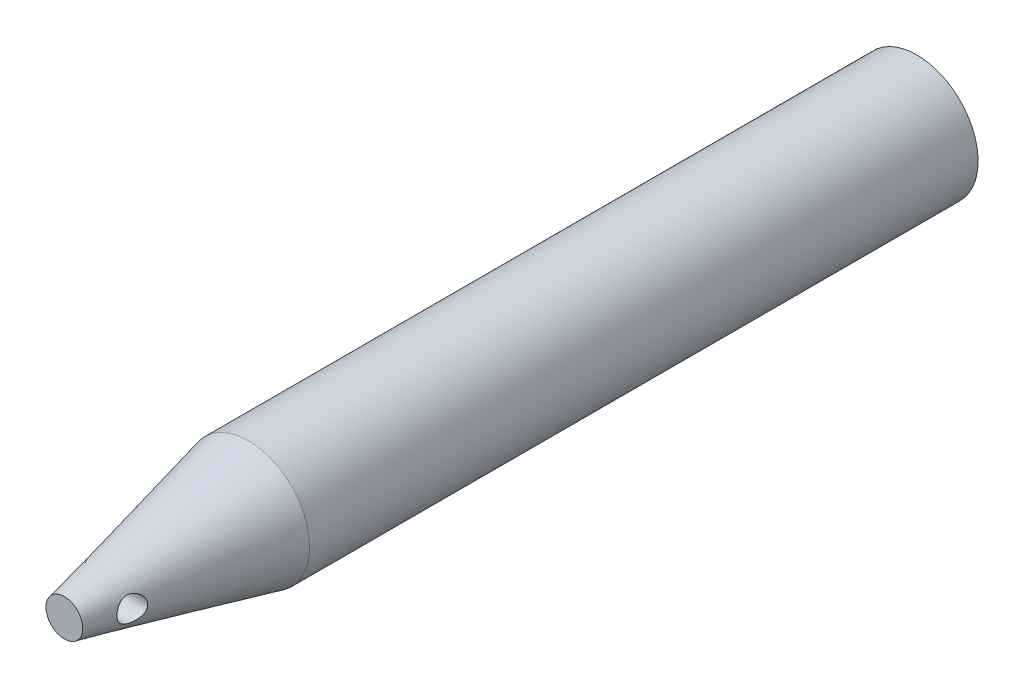
ISO-10303-21;
HEADER;
FILE_DESCRIPTION(('STEP AP214'),'2;1');
FILE_NAME('part.step','',(''),(''),'','','');
FILE_SCHEMA(('AUTOMOTIVE_DESIGN { 1 0 10303 214 1 1 1 1 }'));
ENDSEC;
DATA;
#1=APPLICATION_CONTEXT('core data for automotive mechanical design processes');
#2=APPLICATION_PROTOCOL_DEFINITION('international standard','automotive_design',2000,#1);
#3=PRODUCT_CONTEXT('',#1,'mechanical');
#4=PRODUCT('Part','Part','',(#3));
#5=PRODUCT_RELATED_PRODUCT_CATEGORY('part','',(#4));
#6=PRODUCT_DEFINITION_FORMATION('','',#4);
#7=PRODUCT_DEFINITION_CONTEXT('part definition',#1,'design');
#8=PRODUCT_DEFINITION('design','',#6,#7);
#9=PRODUCT_DEFINITION_SHAPE('','',#8);
#10=(LENGTH_UNIT() NAMED_UNIT(*) SI_UNIT(.MILLI.,.METRE.));
#11=(NAMED_UNIT(*) PLANE_ANGLE_UNIT() SI_UNIT($,.RADIAN.));
#12=(NAMED_UNIT(*) SI_UNIT($,.STERADIAN.) SOLID_ANGLE_UNIT());
#13=UNCERTAINTY_MEASURE_WITH_UNIT(LENGTH_MEASURE(1.E-05),#10,'distance_accuracy_value','');
#14=(GEOMETRIC_REPRESENTATION_CONTEXT(3) GLOBAL_UNCERTAINTY_ASSIGNED_CONTEXT((#13)) GLOBAL_UNIT_ASSIGNED_CONTEXT((#10,
#11,#12)) REPRESENTATION_CONTEXT('',''));
#15=CARTESIAN_POINT('',(0.,0.,0.));
#16=DIRECTION('',(0.,0.,1.));
#17=DIRECTION('',(1.,0.,0.));
#18=AXIS2_PLACEMENT_3D('',#15,#16,#17);
#19=CARTESIAN_POINT('',(0.,0.,65.0011));
#20=DIRECTION('',(0.,0.,-1.));
#21=DIRECTION('',(-1.,0.,0.));
#22=AXIS2_PLACEMENT_3D('',#19,#20,#21);
#23=CYLINDRICAL_SURFACE('',#22,1.24672006807384);
#24=CARTESIAN_POINT('',(0.,0.,-4.49999999999998));
#25=DIRECTION('',(0.,0.,-1.));
#26=DIRECTION('',(-1.,0.,0.));
#27=AXIS2_PLACEMENT_3D('',#24,#25,#26);
#28=CIRCLE('',#27,1.24672006807384);
#29=CARTESIAN_POINT('',(-1.24672006807384,0.,-4.49999999999998));
#30=VERTEX_POINT('',#29);
#31=EDGE_CURVE('E180',#30,#30,#28,.T.);
#32=ORIENTED_EDGE('',*,*,#31,.T.);
#33=EDGE_LOOP('',(#32));
#34=FACE_BOUND('',#33,.T.);
#35=CARTESIAN_POINT('',(0.,0.,-3.99999999999998));
#36=DIRECTION('',(0.,0.,1.));
#37=DIRECTION('',(1.,0.,0.));
#38=AXIS2_PLACEMENT_3D('',#35,#36,#37);
#39=CIRCLE('',#38,1.24672006807384);
#40=CARTESIAN_POINT('',(1.24672006807384,0.,-3.99999999999998));
#41=VERTEX_POINT('',#40);
#42=EDGE_CURVE('E183',#41,#41,#39,.T.);
#43=ORIENTED_EDGE('',*,*,#42,.T.);
#44=EDGE_LOOP('',(#43));
#45=FACE_BOUND('',#44,.T.);
#46=ADVANCED_FACE('F54',(#34,#45),#23,.F.);
#47=CARTESIAN_POINT('',(0.690206703683911,1.331771266468,65.));
#48=CARTESIAN_POINT('',(3.65128836259672,3.41585908567168,50.));
#49=CARTESIAN_POINT('',(3.35374923661992,-0.0486421408998192,65.));
#50=CARTESIAN_POINT('',(10.4830065339401,-3.88671763952176,50.));
#51=CARTESIAN_POINT('',(1.97333582925209,-2.71218467383583,65.));
#52=CARTESIAN_POINT('',(3.18042980874664,-10.7184358108651,50.));
#53=CARTESIAN_POINT('',(-0.690206703683912,-1.331771266468,65.));
#54=CARTESIAN_POINT('',(-3.65128836259672,-3.41585908567168,50.));
#55=CARTESIAN_POINT('',(-3.35374923661992,0.0486421408998196,65.));
#56=CARTESIAN_POINT('',(-10.4830065339401,3.88671763952176,50.));
#57=CARTESIAN_POINT('',(-1.97333582925209,2.71218467383583,65.));
#58=CARTESIAN_POINT('',(-3.18042980874664,10.7184358108651,50.));
#59=CARTESIAN_POINT('',(0.690206703683911,1.331771266468,65.));
#60=CARTESIAN_POINT('',(3.65128836259672,3.41585908567168,50.));
#61=(BOUNDED_SURFACE() B_SPLINE_SURFACE(3,1,((#47,#48),(#49,#50),(#51,#52),(#53,#54),(#55,#56),
(#57,#58),(#59,#60)),.UNSPECIFIED.,.T.,.F.,.F.) B_SPLINE_SURFACE_WITH_KNOTS((4,3,4),(2,2),(0.,
0.5,1.),(0.,1.),.UNSPECIFIED.) GEOMETRIC_REPRESENTATION_ITEM() RATIONAL_B_SPLINE_SURFACE(((1.,
1.),(0.333333333333333,0.333333333333333),(0.333333333333333,0.333333333333333),(1.,1.),
(0.333333333333333,0.333333333333333),(0.333333333333333,0.333333333333333),(1.,1.))) REPRESENTATION_ITEM('') SURFACE());
#62=CARTESIAN_POINT('',(2.00539047793234,0.,62.7160359858396));
#63=CARTESIAN_POINT('',(2.00538750979843,-0.056335212529258,62.716032861578));
#64=CARTESIAN_POINT('',(2.00405141423518,-0.11273205658437,62.711348250363));
#65=CARTESIAN_POINT('',(1.99893495949022,-0.223931049627867,62.692755642932));
#66=CARTESIAN_POINT('',(1.99515026635972,-0.278730190648569,62.6788312915128));
#67=CARTESIAN_POINT('',(1.98583304304209,-0.385033031045637,62.6422497079904));
#68=CARTESIAN_POINT('',(1.98030439759647,-0.436543751823043,62.6196118611883));
#69=CARTESIAN_POINT('',(1.96853499031713,-0.535086387351585,62.566244450846));
#70=CARTESIAN_POINT('',(1.96229423006893,-0.582118312074314,62.5355149053217));
#71=CARTESIAN_POINT('',(1.95024746068222,-0.671685070482941,62.4658432103966));
#72=CARTESIAN_POINT('',(1.94445646145799,-0.714075875925477,62.4267128093435));
#73=CARTESIAN_POINT('',(1.9350575563944,-0.791771314275083,62.3417194331294));
#74=CARTESIAN_POINT('',(1.93144909840078,-0.827077737925972,62.2958581644408));
#75=CARTESIAN_POINT('',(1.92798405093562,-0.888789011572021,62.199793233434));
#76=CARTESIAN_POINT('',(1.92804507061811,-0.915375866749605,62.1497101365075));
#77=CARTESIAN_POINT('',(1.93280084380908,-0.959818354189818,62.0460323476293));
#78=CARTESIAN_POINT('',(1.93749214593556,-0.977680474987447,61.9924402990068));
#79=CARTESIAN_POINT('',(1.95131404008271,-1.00319680979589,61.888044515754));
#80=CARTESIAN_POINT('',(1.96006138066204,-1.01155062186374,61.8373585753975));
#81=CARTESIAN_POINT('',(1.98151034988755,-1.02060183188749,61.736146554833));
#82=CARTESIAN_POINT('',(1.99421312096459,-1.02129701571993,61.6856205250757));
#83=CARTESIAN_POINT('',(2.02315299695636,-1.01535628706345,61.5849493655247));
#84=CARTESIAN_POINT('',(2.03945650443217,-1.00857153432193,61.5348327009357));
#85=CARTESIAN_POINT('',(2.07448685291746,-0.987979337786759,61.4369327938076));
#86=CARTESIAN_POINT('',(2.09321573104613,-0.974165961609963,61.3891515598479));
#87=CARTESIAN_POINT('',(2.13480853571357,-0.93764095175531,61.2901331275128));
#88=CARTESIAN_POINT('',(2.15788490147625,-0.913957140785871,61.2393430348679));
#89=CARTESIAN_POINT('',(2.20446929765277,-0.858734013684023,61.1424100483802));
#90=CARTESIAN_POINT('',(2.22797773250228,-0.827186949785541,61.0962718014128));
#91=CARTESIAN_POINT('',(2.27652710490207,-0.75287704182095,61.004771272934));
#92=CARTESIAN_POINT('',(2.30146228256521,-0.709274540871846,60.9600220506755));
#93=CARTESIAN_POINT('',(2.33651119694981,-0.637662700727745,60.8990165454874));
#94=CARTESIAN_POINT('',(2.34779880446839,-0.612765864912627,60.8797060097428));
#95=CARTESIAN_POINT('',(2.36937684474424,-0.560964644857614,60.8432716857037));
#96=CARTESIAN_POINT('',(2.37966618134242,-0.534058109946399,60.8261502948057));
#97=CARTESIAN_POINT('',(2.40451718501077,-0.462460892642235,60.7852306890072));
#98=CARTESIAN_POINT('',(2.41815656303214,-0.416400295692351,60.7632144111341));
#99=CARTESIAN_POINT('',(2.44136724475181,-0.32064899943711,60.7261231506544));
#100=CARTESIAN_POINT('',(2.45094332728313,-0.27096264546837,60.711040012248));
#101=CARTESIAN_POINT('',(2.46531970829261,-0.168933815481547,60.688501535512));
#102=CARTESIAN_POINT('',(2.47009653578428,-0.116579588889305,60.6810836796252));
#103=CARTESIAN_POINT('',(2.47435163016827,-0.0111405476777702,60.6744724744218));
#104=CARTESIAN_POINT('',(2.47383110659461,0.041944097402203,60.6752772476483));
#105=CARTESIAN_POINT('',(2.46780049784077,0.142822233777383,60.684656605749));
#106=CARTESIAN_POINT('',(2.46269138164312,0.190700235017537,60.6926068331913));
#107=CARTESIAN_POINT('',(2.44842847013039,0.284270821672251,60.7150043373767));
#108=CARTESIAN_POINT('',(2.43927421484714,0.32996315790232,60.7294523529793));
#109=CARTESIAN_POINT('',(2.41718565706171,0.419609944521424,60.7647840044669));
#110=CARTESIAN_POINT('',(2.40413753326131,0.463458704256812,60.7858626399995));
#111=CARTESIAN_POINT('',(2.37517266753866,0.547098293616764,60.8335426481582));
#112=CARTESIAN_POINT('',(2.35925010631655,0.586880630043547,60.8601552411973));
#113=CARTESIAN_POINT('',(2.32312229723602,0.666834287026246,60.9220324650508));
#114=CARTESIAN_POINT('',(2.30262908458308,0.706347852519993,60.9579779482951));
#115=CARTESIAN_POINT('',(2.26026531551312,0.778935451534627,61.0350540687147));
#116=CARTESIAN_POINT('',(2.23839595655295,0.812014983835002,61.0761802283021));
#117=CARTESIAN_POINT('',(2.1913088038958,0.875604461149962,61.1690508980692));
#118=CARTESIAN_POINT('',(2.16605250848117,0.90509933460574,61.2214753628097));
#119=CARTESIAN_POINT('',(2.11694353057043,0.95464050128712,61.3312769760428));
#120=CARTESIAN_POINT('',(2.09309162296773,0.974681620227421,61.3886568164634));
#121=CARTESIAN_POINT('',(2.04824865230701,1.0046562791203,61.5083049961136));
#122=CARTESIAN_POINT('',(2.02731311163019,1.01441221355958,61.5706398529068));
#123=CARTESIAN_POINT('',(1.99074428869497,1.02209656495955,61.6975304904239));
#124=CARTESIAN_POINT('',(1.97510147298592,1.02004636893353,61.7620820447431));
#125=CARTESIAN_POINT('',(1.95216428550828,1.00458855551129,61.8819001463332));
#126=CARTESIAN_POINT('',(1.94401265267496,0.992796437638901,61.9372121341481));
#127=CARTESIAN_POINT('',(1.93277212429836,0.959999281499643,62.0455701857471));
#128=CARTESIAN_POINT('',(1.92968172288251,0.938996985903544,62.0986169189379));
#129=CARTESIAN_POINT('',(1.92797733121164,0.890843778297756,62.1956189703494));
#130=CARTESIAN_POINT('',(1.92896423882386,0.864471056658928,62.2399587752747));
#131=CARTESIAN_POINT('',(1.93359856778548,0.805425636512142,62.3240748598327));
#132=CARTESIAN_POINT('',(1.93724706262376,0.772750399945072,62.3638492906353));
#133=CARTESIAN_POINT('',(1.94635191004111,0.699952479311074,62.4399872925451));
#134=CARTESIAN_POINT('',(1.95189674813018,0.659518781674797,62.4760424500874));
#135=CARTESIAN_POINT('',(1.96344001445731,0.573482660754037,62.5413055026881));
#136=CARTESIAN_POINT('',(1.96943874501043,0.527876782271152,62.5705087800043));
#137=CARTESIAN_POINT('',(1.98110213379857,0.429439387720537,62.6230296889964));
#138=CARTESIAN_POINT('',(1.98671958563614,0.376330719745986,62.6458400920126));
#139=CARTESIAN_POINT('',(1.99603510508436,0.26693546293079,62.6821715722962));
#140=CARTESIAN_POINT('',(1.99973686234866,0.210655216295294,62.6957105228952));
#141=CARTESIAN_POINT('',(2.00321184208506,0.128239599971315,62.7082710200008));
#142=CARTESIAN_POINT('',(2.00402527964499,0.102689227828393,62.7111797065961));
#143=CARTESIAN_POINT('',(2.00511527780076,0.0514301874989936,62.7150629122537));
#144=CARTESIAN_POINT('',(2.00539183312221,0.0257215177598675,62.7160374123142));
#145=CARTESIAN_POINT('',(2.00539047793234,0.,62.7160359858396));
#146=B_SPLINE_CURVE_WITH_KNOTS('',3,(#62,#63,#64,#65,#66,#67,#68,#69,#70,#71,#72,#73,#74,#75,
#76,#77,#78,#79,#80,#81,#82,#83,#84,#85,#86,#87,#88,#89,#90,#91,#92,#93,#94,#95,#96,#97,#98,#99,
#100,#101,#102,#103,#104,#105,#106,#107,#108,#109,#110,#111,#112,#113,#114,#115,#116,#117,#118,
#119,#120,#121,#122,#123,#124,#125,#126,#127,#128,#129,#130,#131,#132,#133,#134,#135,#136,#137,
#138,#139,#140,#141,#142,#143,#144,#145),.UNSPECIFIED.,.T.,.F.,(4,2,2,2,2,2,2,2,2,2,2,2,2,2,2,2,
2,2,2,2,2,2,2,2,2,2,2,2,2,2,2,2,2,2,2,2,2,2,2,2,2,4),(0.,0.168906518848973,0.338112818409071,
0.506944832900138,0.675776471494733,0.848883163250706,1.02194604295044,1.19112462182449,
1.36017719126441,1.51576798933349,1.67140376780732,1.83019329584475,1.9891170701931,
2.17020069796026,2.35146346003785,2.55215185324603,2.65243546899596,2.75282798438277,
2.91063907076073,3.06826403793744,3.22665617911027,3.38501215572024,3.53074733238587,
3.67649908469899,3.82701702504277,3.97784317788778,4.14881454945928,4.31963915381644,
4.51447967552706,4.70942671513362,4.90768757953012,5.10558940399454,5.27602923350601,
5.44641834268855,5.60054449465574,5.75473284419013,5.91741142414137,6.08019932645142,
6.25358991872622,6.42664530372309,6.50376384377355,6.58088314144327),.UNSPECIFIED.);
#147=CARTESIAN_POINT('',(2.00539047793234,0.,62.7160359858396));
#148=VERTEX_POINT('',#147);
#149=EDGE_CURVE('E76',#148,#148,#146,.T.);
#150=CARTESIAN_POINT('',(0.,0.,50.));
#151=DIRECTION('',(0.,0.,-1.));
#152=DIRECTION('',(-1.,0.,0.));
#153=AXIS2_PLACEMENT_3D('',#150,#151,#152);
#154=CIRCLE('',#153,5.);
#155=CARTESIAN_POINT('',(-5.,0.,50.));
#156=VERTEX_POINT('',#155);
#157=EDGE_CURVE('E11',#156,#156,#154,.F.);
#158=CARTESIAN_POINT('',(0.,0.,65.));
#159=DIRECTION('',(0.,0.,1.));
#160=DIRECTION('',(1.,0.,0.));
#161=AXIS2_PLACEMENT_3D('',#158,#159,#160);
#162=CIRCLE('',#161,1.5);
#163=CARTESIAN_POINT('',(1.5,0.,65.));
#164=VERTEX_POINT('',#163);
#165=EDGE_CURVE('E68',#164,#164,#162,.T.);
#166=CARTESIAN_POINT('',(-2.47351243615597,0.,60.6757772958276));
#167=CARTESIAN_POINT('',(-2.47350939755237,0.0512517614717171,60.6757808775187));
#168=CARTESIAN_POINT('',(-2.47100085551312,0.102572362793711,60.6796667316432));
#169=CARTESIAN_POINT('',(-2.46117083763356,0.203650253602837,60.6949992399379));
#170=CARTESIAN_POINT('',(-2.45383944135806,0.253404098808811,60.7064614786882));
#171=CARTESIAN_POINT('',(-2.43500190916026,0.349678871707715,60.736263166789));
#172=CARTESIAN_POINT('',(-2.42351607196587,0.396214230154653,60.7545691915553));
#173=CARTESIAN_POINT('',(-2.39717101581239,0.485329197335725,60.7972612893227));
#174=CARTESIAN_POINT('',(-2.38231202598719,0.527909074483858,60.821646949353));
#175=CARTESIAN_POINT('',(-2.34888009770361,0.611538803330186,60.8777339310327));
#176=CARTESIAN_POINT('',(-2.33011185970509,0.652232598084655,60.9098475842165));
#177=CARTESIAN_POINT('',(-2.29075578678627,0.727875265695764,60.9793154347138));
#178=CARTESIAN_POINT('',(-2.27016652042342,0.762819556250424,61.0166737684674));
#179=CARTESIAN_POINT('',(-2.22503547764406,0.831431402798814,61.1019236032203));
#180=CARTESIAN_POINT('',(-2.20036761637546,0.864102702960933,61.150553369361));
#181=CARTESIAN_POINT('',(-2.15158623496052,0.92079671015541,61.2529332396112));
#182=CARTESIAN_POINT('',(-2.12747323340277,0.944811611344246,61.306687910118));
#183=CARTESIAN_POINT('',(-2.08015478403938,0.984541521111248,61.4216021287806));
#184=CARTESIAN_POINT('',(-2.0570790232656,0.999706579186159,61.4830089703132));
#185=CARTESIAN_POINT('',(-2.01547336325443,1.01841066637488,61.609040496183));
#186=CARTESIAN_POINT('',(-1.99693676671031,1.0219669204646,61.6736602684383));
#187=CARTESIAN_POINT('',(-1.9679013934284,1.01680132262774,61.7964768077037));
#188=CARTESIAN_POINT('',(-1.95672830238494,1.00942966593694,61.8545683787525));
#189=CARTESIAN_POINT('',(-1.93993292756156,0.984545685463533,61.969353491677));
#190=CARTESIAN_POINT('',(-1.93430630425422,0.967041306517808,62.0260480926167));
#191=CARTESIAN_POINT('',(-1.92863474169124,0.925168733561514,62.128818443252));
#192=CARTESIAN_POINT('',(-1.92797648945337,0.901941517923946,62.1753326566736));
#193=CARTESIAN_POINT('',(-1.929846144337,0.848727748713205,62.2642461717954));
#194=CARTESIAN_POINT('',(-1.93237478696415,0.818739636099718,62.3066445211599));
#195=CARTESIAN_POINT('',(-1.93965426058851,0.751907585352391,62.387368769411));
#196=CARTESIAN_POINT('',(-1.94446330994859,0.714900243969675,62.4255536125652));
#197=CARTESIAN_POINT('',(-1.95508627700099,0.635492268559931,62.4956698774979));
#198=CARTESIAN_POINT('',(-1.9609005485953,0.593089736476545,62.5275990884232));
#199=CARTESIAN_POINT('',(-1.97281505790894,0.500381612205798,62.5867101446001));
#200=CARTESIAN_POINT('',(-1.97890281851191,0.449718835708758,62.6133367587875));
#201=CARTESIAN_POINT('',(-1.98966908248351,0.344526703430168,62.6577927671033));
#202=CARTESIAN_POINT('',(-1.99434766809973,0.289997573540911,62.6756226746971));
#203=CARTESIAN_POINT('',(-2.00141120914253,0.17859024945108,62.7019098660092));
#204=CARTESIAN_POINT('',(-2.00379697491321,0.121712892594851,62.7103704612553));
#205=CARTESIAN_POINT('',(-2.00583407746576,0.0073026338546797,62.7176182835173));
#206=CARTESIAN_POINT('',(-2.00548597378696,-0.0502301314803308,62.7164074899693));
#207=CARTESIAN_POINT('',(-2.00217935216626,-0.162283807748381,62.704567417139));
#208=CARTESIAN_POINT('',(-1.99930837241258,-0.216841145343037,62.6942539290079));
#209=CARTESIAN_POINT('',(-1.99157530711501,-0.323435737618719,62.6649831535257));
#210=CARTESIAN_POINT('',(-1.98671293293784,-0.375472625761928,62.6460246131132));
#211=CARTESIAN_POINT('',(-1.97577554206129,-0.476498515684362,62.5996499058655));
#212=CARTESIAN_POINT('',(-1.96968250074572,-0.525426021221295,62.5721042571782));
#213=CARTESIAN_POINT('',(-1.95753439944578,-0.618131487735594,62.5093633520885));
#214=CARTESIAN_POINT('',(-1.95147935430217,-0.661907542354369,62.4741652774456));
#215=CARTESIAN_POINT('',(-1.94065091447321,-0.744421364385945,62.3957878072454));
#216=CARTESIAN_POINT('',(-1.93592149274532,-0.782968240342011,62.3524003867455));
#217=CARTESIAN_POINT('',(-1.92959710456798,-0.852227763830627,62.2595725388077));
#218=CARTESIAN_POINT('',(-1.9280000432065,-0.882945635404388,62.2101361804027));
#219=CARTESIAN_POINT('',(-1.92927236855198,-0.934197416549782,62.1093921287012));
#220=CARTESIAN_POINT('',(-1.93192142465582,-0.955165380839554,62.058303179598));
#221=CARTESIAN_POINT('',(-1.94193292621383,-0.988500947244006,61.9538460827008));
#222=CARTESIAN_POINT('',(-1.94929349866498,-1.00087196289144,61.9004788484747));
#223=CARTESIAN_POINT('',(-1.96801778717868,-1.01638590831811,61.7968476641191));
#224=CARTESIAN_POINT('',(-1.97908604340678,-1.02008276588373,61.7466107242225));
#225=CARTESIAN_POINT('',(-2.00471998909845,-1.02017509710348,61.6470400350045));
#226=CARTESIAN_POINT('',(-2.01928694144345,-1.01656793081218,61.597706618753));
#227=CARTESIAN_POINT('',(-2.05211965813966,-1.00206421903105,61.4978131895277));
#228=CARTESIAN_POINT('',(-2.07056324112508,-0.99071308712375,61.4473788702819));
#229=CARTESIAN_POINT('',(-2.10938909725274,-0.960861991465391,61.34944681205));
#230=CARTESIAN_POINT('',(-2.12977314250593,-0.942355444953656,61.301951823969));
#231=CARTESIAN_POINT('',(-2.17449952067471,-0.895429351390638,61.2037133716325));
#232=CARTESIAN_POINT('',(-2.19898027259453,-0.86594610334582,61.1535342200505));
#233=CARTESIAN_POINT('',(-2.23534225755973,-0.81561596681741,61.0824917010115));
#234=CARTESIAN_POINT('',(-2.24740737943438,-0.797814133494116,61.0595076490615));
#235=CARTESIAN_POINT('',(-2.27125543000367,-0.76019277482124,61.015009159086));
#236=CARTESIAN_POINT('',(-2.28303777013161,-0.740369427609686,60.9934976382528));
#237=CARTESIAN_POINT('',(-2.31912540232029,-0.675310244038513,60.9287575334138));
#238=CARTESIAN_POINT('',(-2.34256556044495,-0.62663115433827,60.8884018014586));
#239=CARTESIAN_POINT('',(-2.38516122788295,-0.521410041394234,60.8168003850412));
#240=CARTESIAN_POINT('',(-2.40432489083532,-0.46488332038638,60.7855373291847));
#241=CARTESIAN_POINT('',(-2.43253114743642,-0.360060564783107,60.7401644815397));
#242=CARTESIAN_POINT('',(-2.4429023418193,-0.313121307249035,60.7237306010352));
#243=CARTESIAN_POINT('',(-2.459353934268,-0.216707420495827,60.69781947321));
#244=CARTESIAN_POINT('',(-2.46544565420445,-0.167239855479724,60.6883238671466));
#245=CARTESIAN_POINT('',(-2.47060926805496,-0.097807377049536,60.6802874799454));
#246=CARTESIAN_POINT('',(-2.47169581363293,-0.078304959597482,60.6785986612398));
#247=CARTESIAN_POINT('',(-2.47314804925916,-0.0392050651566994,60.676342774606));
#248=CARTESIAN_POINT('',(-2.47351359864546,-0.0196075703664174,60.6757759255672));
#249=CARTESIAN_POINT('',(-2.47351243615597,0.,60.6757772958276));
#250=B_SPLINE_CURVE_WITH_KNOTS('',3,(#166,#167,#168,#169,#170,#171,#172,#173,#174,#175,#176,
#177,#178,#179,#180,#181,#182,#183,#184,#185,#186,#187,#188,#189,#190,#191,#192,#193,#194,#195,
#196,#197,#198,#199,#200,#201,#202,#203,#204,#205,#206,#207,#208,#209,#210,#211,#212,#213,#214,
#215,#216,#217,#218,#219,#220,#221,#222,#223,#224,#225,#226,#227,#228,#229,#230,#231,#232,#233,
#234,#235,#236,#237,#238,#239,#240,#241,#242,#243,#244,#245,#246,#247,#248,#249),.UNSPECIFIED.,
.T.,.F.,(4,2,2,2,2,2,2,2,2,2,2,2,2,2,2,2,2,2,2,2,2,2,2,2,2,2,2,2,2,2,2,2,2,2,2,2,2,2,2,2,2,4),
(0.,0.153673535046425,0.307664163521053,0.460912333842943,0.614150097328095,0.778915359711805,
0.943811308988543,1.13369983909408,1.32375917392467,1.52463177771932,1.72520619383895,
1.90297269784201,2.08060000760679,2.23587403953967,2.3911839138362,2.55069182076666,
2.71025599938038,2.88211282051861,3.05395960915598,3.22574564016305,3.39749651274823,
3.56351338292136,3.72955432414794,3.89823105712105,4.06697001602076,4.24077872339712,
4.4144711484051,4.57943858392398,4.74434047944522,4.89838571595613,5.05248664007348,
5.21651416135483,5.38069294332913,5.56924229231042,5.66358553275552,5.75811056650194,
5.95925555268866,6.16001369201845,6.31179006433652,6.46316336599832,6.52194333546971,
6.58073477141951),.UNSPECIFIED.);
#251=CARTESIAN_POINT('',(-2.47351243615597,0.,60.6757772958276));
#252=VERTEX_POINT('',#251);
#253=EDGE_CURVE('E126',#252,#252,#250,.T.);
#254=ORIENTED_EDGE('',*,*,#149,.F.);
#255=EDGE_LOOP('',(#254));
#256=FACE_BOUND('',#255,.T.);
#257=ORIENTED_EDGE('',*,*,#157,.T.);
#258=EDGE_LOOP('',(#257));
#259=FACE_BOUND('',#258,.T.);
#260=ORIENTED_EDGE('',*,*,#165,.F.);
#261=EDGE_LOOP('',(#260));
#262=FACE_BOUND('',#261,.T.);
#263=ORIENTED_EDGE('',*,*,#253,.T.);
#264=EDGE_LOOP('',(#263));
#265=FACE_BOUND('',#264,.T.);
#266=ADVANCED_FACE('F96',(#256,#259,#262,#265),#61,.T.);
#267=CARTESIAN_POINT('',(0.,0.,50.));
#268=DIRECTION('',(0.,0.,-1.));
#269=DIRECTION('',(-1.,0.,0.));
#270=AXIS2_PLACEMENT_3D('',#267,#268,#269);
#271=CYLINDRICAL_SURFACE('',#270,5.);
#272=ORIENTED_EDGE('',*,*,#157,.F.);
#273=EDGE_LOOP('',(#272));
#274=FACE_BOUND('',#273,.T.);
#275=CARTESIAN_POINT('',(0.,0.,-4.49999999999998));
#276=DIRECTION('',(0.,0.,-1.));
#277=DIRECTION('',(-1.,0.,0.));
#278=AXIS2_PLACEMENT_3D('',#275,#276,#277);
#279=CIRCLE('',#278,5.);
#280=CARTESIAN_POINT('',(-5.,0.,-4.49999999999998));
#281=VERTEX_POINT('',#280);
#282=EDGE_CURVE('E196',#281,#281,#279,.T.);
#283=ORIENTED_EDGE('',*,*,#282,.F.);
#284=EDGE_LOOP('',(#283));
#285=FACE_BOUND('',#284,.T.);
#286=ADVANCED_FACE('F56',(#274,#285),#271,.T.);
#287=CARTESIAN_POINT('',(0.,0.,65.));
#288=DIRECTION('',(0.,0.,1.));
#289=DIRECTION('',(1.,0.,0.));
#290=AXIS2_PLACEMENT_3D('',#287,#288,#289);
#291=PLANE('',#290);
#292=ORIENTED_EDGE('',*,*,#165,.T.);
#293=EDGE_LOOP('',(#292));
#294=FACE_BOUND('',#293,.T.);
#295=ADVANCED_FACE('F82',(#294),#291,.T.);
#296=CARTESIAN_POINT('',(5.85107132740283,0.,61.6959066408336));
#297=DIRECTION('',(-1.,0.,0.));
#298=DIRECTION('',(0.,0.,1.));
#299=AXIS2_PLACEMENT_3D('',#296,#297,#298);
#300=CYLINDRICAL_SURFACE('',#299,1.020129345006);
#301=ORIENTED_EDGE('',*,*,#149,.T.);
#302=EDGE_LOOP('',(#301));
#303=FACE_BOUND('',#302,.T.);
#304=ORIENTED_EDGE('',*,*,#253,.F.);
#305=EDGE_LOOP('',(#304));
#306=FACE_BOUND('',#305,.T.);
#307=ADVANCED_FACE('F92',(#303,#306),#300,.F.);
#308=CARTESIAN_POINT('',(0.,0.,-4.49999999999998));
#309=DIRECTION('',(0.,0.,-1.));
#310=DIRECTION('',(-1.,0.,0.));
#311=AXIS2_PLACEMENT_3D('',#308,#309,#310);
#312=PLANE('',#311);
#313=ORIENTED_EDGE('',*,*,#31,.F.);
#314=EDGE_LOOP('',(#313));
#315=FACE_BOUND('',#314,.T.);
#316=ORIENTED_EDGE('',*,*,#282,.T.);
#317=EDGE_LOOP('',(#316));
#318=FACE_BOUND('',#317,.T.);
#319=ADVANCED_FACE('F157',(#315,#318),#312,.T.);
#320=CARTESIAN_POINT('',(0.,0.,-3.74999999999998));
#321=DIRECTION('',(0.,0.,1.));
#322=DIRECTION('',(1.,0.,0.));
#323=AXIS2_PLACEMENT_3D('',#320,#321,#322);
#324=TOROIDAL_SURFACE('',#323,1.24672006807384,0.25);
#325=CARTESIAN_POINT('',(0.,0.,-3.49999999999998));
#326=DIRECTION('',(0.,0.,1.));
#327=DIRECTION('',(1.,0.,0.));
#328=AXIS2_PLACEMENT_3D('',#325,#326,#327);
#329=CIRCLE('',#328,1.24672006807384);
#330=CARTESIAN_POINT('',(1.24672006807384,0.,-3.49999999999998));
#331=VERTEX_POINT('',#330);
#332=EDGE_CURVE('E186',#331,#331,#329,.T.);
#333=ORIENTED_EDGE('',*,*,#332,.T.);
#334=EDGE_LOOP('',(#333));
#335=FACE_BOUND('',#334,.T.);
#336=ORIENTED_EDGE('',*,*,#42,.F.);
#337=EDGE_LOOP('',(#336));
#338=FACE_BOUND('',#337,.T.);
#339=ADVANCED_FACE('F160',(#335,#338),#324,.F.);
#340=CARTESIAN_POINT('',(0.,0.,50.));
#341=DIRECTION('',(0.,0.,1.));
#342=DIRECTION('',(1.,0.,0.));
#343=AXIS2_PLACEMENT_3D('',#340,#341,#342);
#344=PLANE('',#343);
#345=CARTESIAN_POINT('',(0.,0.,50.));
#346=DIRECTION('',(0.,0.,1.));
#347=DIRECTION('',(1.,0.,0.));
#348=AXIS2_PLACEMENT_3D('',#345,#346,#347);
#349=CIRCLE('',#348,4.);
#350=CARTESIAN_POINT('',(4.,0.,50.));
#351=VERTEX_POINT('',#350);
#352=EDGE_CURVE('E63',#351,#351,#349,.T.);
#353=ORIENTED_EDGE('',*,*,#352,.F.);
#354=EDGE_LOOP('',(#353));
#355=FACE_BOUND('',#354,.T.);
#356=ADVANCED_FACE('F103',(#355),#344,.F.);
#357=CARTESIAN_POINT('',(0.,0.,50.));
#358=DIRECTION('',(0.,0.,-1.));
#359=DIRECTION('',(-1.,0.,0.));
#360=AXIS2_PLACEMENT_3D('',#357,#358,#359);
#361=CYLINDRICAL_SURFACE('',#360,4.);
#362=ORIENTED_EDGE('',*,*,#352,.T.);
#363=EDGE_LOOP('',(#362));
#364=FACE_BOUND('',#363,.T.);
#365=CARTESIAN_POINT('',(0.,0.,-2.99999999999998));
#366=DIRECTION('',(0.,0.,1.));
#367=DIRECTION('',(1.,0.,0.));
#368=AXIS2_PLACEMENT_3D('',#365,#366,#367);
#369=CIRCLE('',#368,4.);
#370=CARTESIAN_POINT('',(4.,0.,-2.99999999999998));
#371=VERTEX_POINT('',#370);
#372=EDGE_CURVE('E199',#371,#371,#369,.T.);
#373=ORIENTED_EDGE('',*,*,#372,.F.);
#374=EDGE_LOOP('',(#373));
#375=FACE_BOUND('',#374,.T.);
#376=ADVANCED_FACE('F155',(#364,#375),#361,.F.);
#377=CARTESIAN_POINT('',(0.,0.,-2.99999999999998));
#378=DIRECTION('',(0.,0.,-1.));
#379=DIRECTION('',(-1.,0.,0.));
#380=AXIS2_PLACEMENT_3D('',#377,#378,#379);
#381=PLANE('',#380);
#382=CARTESIAN_POINT('',(0.,0.,-2.99999999999998));
#383=DIRECTION('',(0.,0.,-1.));
#384=DIRECTION('',(-1.,0.,0.));
#385=AXIS2_PLACEMENT_3D('',#382,#383,#384);
#386=CIRCLE('',#385,1.24672006807384);
#387=CARTESIAN_POINT('',(-1.24672006807384,0.,-2.99999999999998));
#388=VERTEX_POINT('',#387);
#389=EDGE_CURVE('E185',#388,#388,#386,.F.);
#390=ORIENTED_EDGE('',*,*,#389,.F.);
#391=EDGE_LOOP('',(#390));
#392=FACE_BOUND('',#391,.T.);
#393=ORIENTED_EDGE('',*,*,#372,.T.);
#394=EDGE_LOOP('',(#393));
#395=FACE_BOUND('',#394,.T.);
#396=ADVANCED_FACE('F146',(#392,#395),#381,.F.);
#397=ORIENTED_EDGE('',*,*,#389,.T.);
#398=EDGE_LOOP('',(#397));
#399=FACE_BOUND('',#398,.T.);
#400=ORIENTED_EDGE('',*,*,#332,.F.);
#401=EDGE_LOOP('',(#400));
#402=FACE_BOUND('',#401,.T.);
#403=ADVANCED_FACE('F154',(#399,#402),#23,.F.);
#404=CLOSED_SHELL('',(#46,#266,#286,#295,#307,#319,#339,#356,#376,#396,#403));
#405=MANIFOLD_SOLID_BREP('B2',#404);
#406=ADVANCED_BREP_SHAPE_REPRESENTATION('',(#18,#405),#14);
#407=SHAPE_DEFINITION_REPRESENTATION(#9,#406);
ENDSEC;
END-ISO-10303-21;
